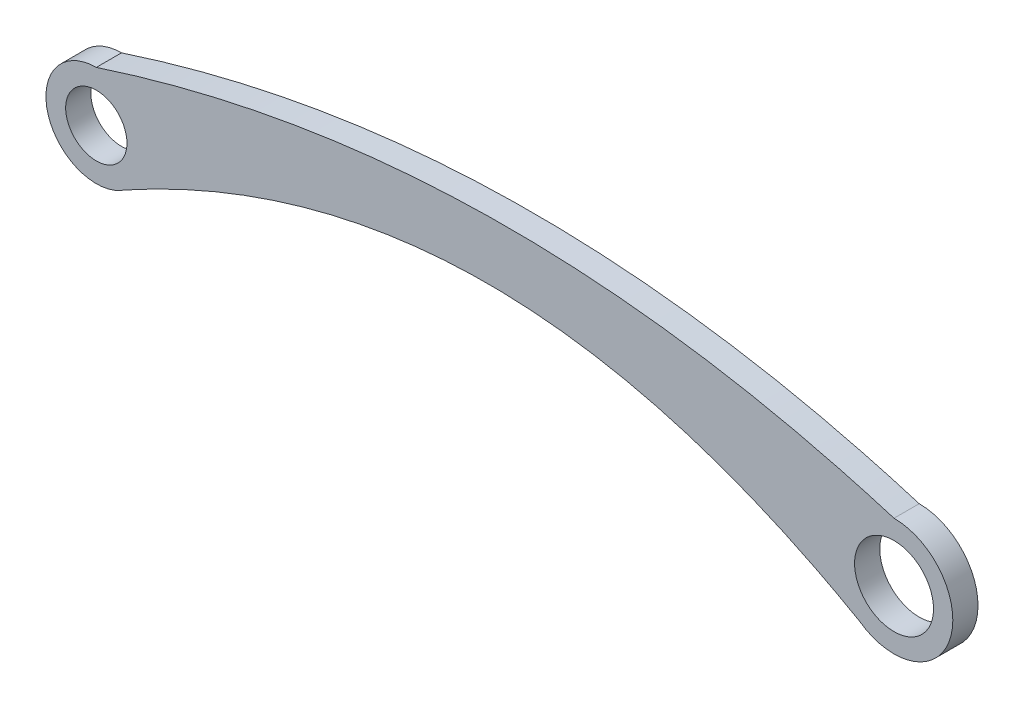
ISO-10303-21;
HEADER;
FILE_DESCRIPTION(('STEP AP214'),'2;1');
FILE_NAME('part.step','',(''),(''),'','','');
FILE_SCHEMA(('AUTOMOTIVE_DESIGN { 1 0 10303 214 1 1 1 1 }'));
ENDSEC;
DATA;
#1=APPLICATION_CONTEXT('core data for automotive mechanical design processes');
#2=APPLICATION_PROTOCOL_DEFINITION('international standard','automotive_design',2000,#1);
#3=PRODUCT_CONTEXT('',#1,'mechanical');
#4=PRODUCT('Part','Part','',(#3));
#5=PRODUCT_RELATED_PRODUCT_CATEGORY('part','',(#4));
#6=PRODUCT_DEFINITION_FORMATION('','',#4);
#7=PRODUCT_DEFINITION_CONTEXT('part definition',#1,'design');
#8=PRODUCT_DEFINITION('design','',#6,#7);
#9=PRODUCT_DEFINITION_SHAPE('','',#8);
#10=(LENGTH_UNIT() NAMED_UNIT(*) SI_UNIT(.MILLI.,.METRE.));
#11=(NAMED_UNIT(*) PLANE_ANGLE_UNIT() SI_UNIT($,.RADIAN.));
#12=(NAMED_UNIT(*) SI_UNIT($,.STERADIAN.) SOLID_ANGLE_UNIT());
#13=UNCERTAINTY_MEASURE_WITH_UNIT(LENGTH_MEASURE(1.E-05),#10,'distance_accuracy_value','');
#14=(GEOMETRIC_REPRESENTATION_CONTEXT(3) GLOBAL_UNCERTAINTY_ASSIGNED_CONTEXT((#13)) GLOBAL_UNIT_ASSIGNED_CONTEXT((#10,
#11,#12)) REPRESENTATION_CONTEXT('',''));
#15=CARTESIAN_POINT('',(0.,0.,0.));
#16=DIRECTION('',(0.,0.,1.));
#17=DIRECTION('',(1.,0.,0.));
#18=AXIS2_PLACEMENT_3D('',#15,#16,#17);
#19=CARTESIAN_POINT('',(3.38591699860707,2.04666111814024,3.));
#20=CARTESIAN_POINT('',(47.3998036648114,26.3274981216897,3.));
#21=CARTESIAN_POINT('',(90.9267954340665,1.30710929631895,3.));
#22=B_SPLINE_CURVE_WITH_KNOTS('',2,(#19,#20,#21),.UNSPECIFIED.,.F.,.F.,(3,3),(0.,1.),.UNSPECIFIED.);
#23=DIRECTION('',(0.,0.,-1.));
#24=VECTOR('',#23,1.);
#25=SURFACE_OF_LINEAR_EXTRUSION('',#22,#24);
#26=CARTESIAN_POINT('',(3.38591699860707,2.04666111814024,0.));
#27=CARTESIAN_POINT('',(47.3998036648114,26.3274981216897,0.));
#28=CARTESIAN_POINT('',(90.9267954340665,1.30710929631895,0.));
#29=B_SPLINE_CURVE_WITH_KNOTS('',2,(#26,#27,#28),.UNSPECIFIED.,.F.,.F.,(3,3),(0.,1.),.UNSPECIFIED.);
#30=CARTESIAN_POINT('',(3.38591699860707,2.04666111814024,0.));
#31=VERTEX_POINT('',#30);
#32=CARTESIAN_POINT('',(90.9267954340665,1.30710929631895,0.));
#33=VERTEX_POINT('',#32);
#34=EDGE_CURVE('E147',#31,#33,#29,.T.);
#35=ORIENTED_EDGE('',*,*,#34,.T.);
#36=DIRECTION('',(0.,0.,-1.));
#37=VECTOR('',#36,1.);
#38=CARTESIAN_POINT('',(90.9267954340665,1.30710929631895,3.));
#39=LINE('',#38,#37);
#40=CARTESIAN_POINT('',(90.9267954340665,1.30710929631895,3.));
#41=VERTEX_POINT('',#40);
#42=EDGE_CURVE('E11',#41,#33,#39,.T.);
#43=ORIENTED_EDGE('',*,*,#42,.F.);
#44=CARTESIAN_POINT('',(3.38591699860707,2.04666111814024,3.));
#45=VERTEX_POINT('',#44);
#46=EDGE_CURVE('E86',#45,#41,#22,.T.);
#47=ORIENTED_EDGE('',*,*,#46,.F.);
#48=DIRECTION('',(0.,0.,-1.));
#49=VECTOR('',#48,1.);
#50=CARTESIAN_POINT('',(3.38591699860707,2.04666111814024,3.));
#51=LINE('',#50,#49);
#52=EDGE_CURVE('E136',#45,#31,#51,.T.);
#53=ORIENTED_EDGE('',*,*,#52,.T.);
#54=EDGE_LOOP('',(#35,#43,#47,#53));
#55=FACE_BOUND('',#54,.T.);
#56=ADVANCED_FACE('F37',(#55),#25,.F.);
#57=CARTESIAN_POINT('',(95.,7.,3.));
#58=DIRECTION('',(0.,0.,-1.));
#59=DIRECTION('',(-1.,0.,0.));
#60=AXIS2_PLACEMENT_3D('',#57,#58,#59);
#61=CYLINDRICAL_SURFACE('',#60,7.);
#62=CARTESIAN_POINT('',(95.,7.,0.));
#63=DIRECTION('',(0.,0.,1.));
#64=DIRECTION('',(1.,0.,0.));
#65=AXIS2_PLACEMENT_3D('',#62,#63,#64);
#66=CIRCLE('',#65,7.);
#67=CARTESIAN_POINT('',(95.,14.,0.));
#68=VERTEX_POINT('',#67);
#69=EDGE_CURVE('E91',#33,#68,#66,.T.);
#70=ORIENTED_EDGE('',*,*,#69,.T.);
#71=DIRECTION('',(0.,0.,-1.));
#72=VECTOR('',#71,1.);
#73=CARTESIAN_POINT('',(95.,14.,3.));
#74=LINE('',#73,#72);
#75=CARTESIAN_POINT('',(95.,14.,3.));
#76=VERTEX_POINT('',#75);
#77=EDGE_CURVE('E46',#76,#68,#74,.T.);
#78=ORIENTED_EDGE('',*,*,#77,.F.);
#79=CARTESIAN_POINT('',(95.,7.,3.));
#80=DIRECTION('',(0.,0.,1.));
#81=DIRECTION('',(1.,0.,0.));
#82=AXIS2_PLACEMENT_3D('',#79,#80,#81);
#83=CIRCLE('',#82,7.);
#84=EDGE_CURVE('E80',#41,#76,#83,.T.);
#85=ORIENTED_EDGE('',*,*,#84,.F.);
#86=ORIENTED_EDGE('',*,*,#42,.T.);
#87=EDGE_LOOP('',(#70,#78,#85,#86));
#88=FACE_BOUND('',#87,.T.);
#89=ADVANCED_FACE('F90',(#88),#61,.T.);
#90=CARTESIAN_POINT('',(0.,13.,3.));
#91=CARTESIAN_POINT('',(47.3459617886758,28.498417981778,3.));
#92=CARTESIAN_POINT('',(95.,14.,3.));
#93=B_SPLINE_CURVE_WITH_KNOTS('',2,(#90,#91,#92),.UNSPECIFIED.,.F.,.F.,(3,3),(0.,1.),.UNSPECIFIED.);
#94=DIRECTION('',(0.,0.,-1.));
#95=VECTOR('',#94,1.);
#96=SURFACE_OF_LINEAR_EXTRUSION('',#93,#95);
#97=CARTESIAN_POINT('',(0.,13.,0.));
#98=CARTESIAN_POINT('',(47.3459617886758,28.498417981778,0.));
#99=CARTESIAN_POINT('',(95.,14.,0.));
#100=B_SPLINE_CURVE_WITH_KNOTS('',2,(#97,#98,#99),.UNSPECIFIED.,.F.,.F.,(3,3),(0.,1.),.UNSPECIFIED.);
#101=CARTESIAN_POINT('',(0.,13.,0.));
#102=VERTEX_POINT('',#101);
#103=EDGE_CURVE('E132',#102,#68,#100,.T.);
#104=ORIENTED_EDGE('',*,*,#103,.F.);
#105=DIRECTION('',(0.,0.,-1.));
#106=VECTOR('',#105,1.);
#107=CARTESIAN_POINT('',(0.,13.,3.));
#108=LINE('',#107,#106);
#109=CARTESIAN_POINT('',(0.,13.,3.));
#110=VERTEX_POINT('',#109);
#111=EDGE_CURVE('E70',#110,#102,#108,.T.);
#112=ORIENTED_EDGE('',*,*,#111,.F.);
#113=EDGE_CURVE('E84',#110,#76,#93,.T.);
#114=ORIENTED_EDGE('',*,*,#113,.T.);
#115=ORIENTED_EDGE('',*,*,#77,.T.);
#116=EDGE_LOOP('',(#104,#112,#114,#115));
#117=FACE_BOUND('',#116,.T.);
#118=ADVANCED_FACE('F95',(#117),#96,.T.);
#119=CARTESIAN_POINT('',(0.,7.,3.));
#120=DIRECTION('',(0.,0.,-1.));
#121=DIRECTION('',(-1.,0.,0.));
#122=AXIS2_PLACEMENT_3D('',#119,#120,#121);
#123=CYLINDRICAL_SURFACE('',#122,6.);
#124=CARTESIAN_POINT('',(0.,7.,0.));
#125=DIRECTION('',(0.,0.,1.));
#126=DIRECTION('',(1.,0.,0.));
#127=AXIS2_PLACEMENT_3D('',#124,#125,#126);
#128=CIRCLE('',#127,6.);
#129=EDGE_CURVE('E73',#102,#31,#128,.T.);
#130=ORIENTED_EDGE('',*,*,#129,.T.);
#131=ORIENTED_EDGE('',*,*,#52,.F.);
#132=CARTESIAN_POINT('',(0.,7.,3.));
#133=DIRECTION('',(0.,0.,1.));
#134=DIRECTION('',(1.,0.,0.));
#135=AXIS2_PLACEMENT_3D('',#132,#133,#134);
#136=CIRCLE('',#135,6.);
#137=EDGE_CURVE('E54',#110,#45,#136,.T.);
#138=ORIENTED_EDGE('',*,*,#137,.F.);
#139=ORIENTED_EDGE('',*,*,#111,.T.);
#140=EDGE_LOOP('',(#130,#131,#138,#139));
#141=FACE_BOUND('',#140,.T.);
#142=ADVANCED_FACE('F111',(#141),#123,.T.);
#143=CARTESIAN_POINT('',(95.,7.,3.));
#144=DIRECTION('',(0.,0.,-1.));
#145=DIRECTION('',(-1.,0.,0.));
#146=AXIS2_PLACEMENT_3D('',#143,#144,#145);
#147=CYLINDRICAL_SURFACE('',#146,4.69999999999999);
#148=CARTESIAN_POINT('',(95.,7.,3.));
#149=DIRECTION('',(0.,0.,1.));
#150=DIRECTION('',(1.,0.,0.));
#151=AXIS2_PLACEMENT_3D('',#148,#149,#150);
#152=CIRCLE('',#151,4.69999999999999);
#153=CARTESIAN_POINT('',(99.7,7.,3.));
#154=VERTEX_POINT('',#153);
#155=EDGE_CURVE('E120',#154,#154,#152,.T.);
#156=ORIENTED_EDGE('',*,*,#155,.T.);
#157=EDGE_LOOP('',(#156));
#158=FACE_BOUND('',#157,.T.);
#159=CARTESIAN_POINT('',(95.,7.,0.));
#160=DIRECTION('',(0.,0.,1.));
#161=DIRECTION('',(1.,0.,0.));
#162=AXIS2_PLACEMENT_3D('',#159,#160,#161);
#163=CIRCLE('',#162,4.69999999999999);
#164=CARTESIAN_POINT('',(99.7,7.,0.));
#165=VERTEX_POINT('',#164);
#166=EDGE_CURVE('E144',#165,#165,#163,.T.);
#167=ORIENTED_EDGE('',*,*,#166,.F.);
#168=EDGE_LOOP('',(#167));
#169=FACE_BOUND('',#168,.T.);
#170=ADVANCED_FACE('F39',(#158,#169),#147,.F.);
#171=CARTESIAN_POINT('',(0.,7.,3.));
#172=DIRECTION('',(0.,0.,-1.));
#173=DIRECTION('',(-1.,0.,0.));
#174=AXIS2_PLACEMENT_3D('',#171,#172,#173);
#175=CYLINDRICAL_SURFACE('',#174,3.65);
#176=CARTESIAN_POINT('',(0.,7.,3.));
#177=DIRECTION('',(0.,0.,1.));
#178=DIRECTION('',(1.,0.,0.));
#179=AXIS2_PLACEMENT_3D('',#176,#177,#178);
#180=CIRCLE('',#179,3.65);
#181=CARTESIAN_POINT('',(3.65,7.,3.));
#182=VERTEX_POINT('',#181);
#183=EDGE_CURVE('E97',#182,#182,#180,.T.);
#184=ORIENTED_EDGE('',*,*,#183,.T.);
#185=EDGE_LOOP('',(#184));
#186=FACE_BOUND('',#185,.T.);
#187=CARTESIAN_POINT('',(0.,7.,0.));
#188=DIRECTION('',(0.,0.,1.));
#189=DIRECTION('',(1.,0.,0.));
#190=AXIS2_PLACEMENT_3D('',#187,#188,#189);
#191=CIRCLE('',#190,3.65);
#192=CARTESIAN_POINT('',(3.65,7.,0.));
#193=VERTEX_POINT('',#192);
#194=EDGE_CURVE('E125',#193,#193,#191,.T.);
#195=ORIENTED_EDGE('',*,*,#194,.F.);
#196=EDGE_LOOP('',(#195));
#197=FACE_BOUND('',#196,.T.);
#198=ADVANCED_FACE('F167',(#186,#197),#175,.F.);
#199=CARTESIAN_POINT('',(0.,0.,3.));
#200=DIRECTION('',(0.,0.,1.));
#201=DIRECTION('',(1.,0.,0.));
#202=AXIS2_PLACEMENT_3D('',#199,#200,#201);
#203=PLANE('',#202);
#204=ORIENTED_EDGE('',*,*,#155,.F.);
#205=EDGE_LOOP('',(#204));
#206=FACE_BOUND('',#205,.T.);
#207=ORIENTED_EDGE('',*,*,#46,.T.);
#208=ORIENTED_EDGE('',*,*,#84,.T.);
#209=ORIENTED_EDGE('',*,*,#113,.F.);
#210=ORIENTED_EDGE('',*,*,#137,.T.);
#211=EDGE_LOOP('',(#207,#208,#209,#210));
#212=FACE_BOUND('',#211,.T.);
#213=ORIENTED_EDGE('',*,*,#183,.F.);
#214=EDGE_LOOP('',(#213));
#215=FACE_BOUND('',#214,.T.);
#216=ADVANCED_FACE('F81',(#206,#212,#215),#203,.T.);
#217=CARTESIAN_POINT('',(0.,0.,0.));
#218=DIRECTION('',(0.,0.,1.));
#219=DIRECTION('',(1.,0.,0.));
#220=AXIS2_PLACEMENT_3D('',#217,#218,#219);
#221=PLANE('',#220);
#222=ORIENTED_EDGE('',*,*,#166,.T.);
#223=EDGE_LOOP('',(#222));
#224=FACE_BOUND('',#223,.T.);
#225=ORIENTED_EDGE('',*,*,#34,.F.);
#226=ORIENTED_EDGE('',*,*,#129,.F.);
#227=ORIENTED_EDGE('',*,*,#103,.T.);
#228=ORIENTED_EDGE('',*,*,#69,.F.);
#229=EDGE_LOOP('',(#225,#226,#227,#228));
#230=FACE_BOUND('',#229,.T.);
#231=ORIENTED_EDGE('',*,*,#194,.T.);
#232=EDGE_LOOP('',(#231));
#233=FACE_BOUND('',#232,.T.);
#234=ADVANCED_FACE('F160',(#224,#230,#233),#221,.F.);
#235=CLOSED_SHELL('',(#56,#89,#118,#142,#170,#198,#216,#234));
#236=MANIFOLD_SOLID_BREP('B2',#235);
#237=ADVANCED_BREP_SHAPE_REPRESENTATION('',(#18,#236),#14);
#238=SHAPE_DEFINITION_REPRESENTATION(#9,#237);
ENDSEC;
END-ISO-10303-21;
